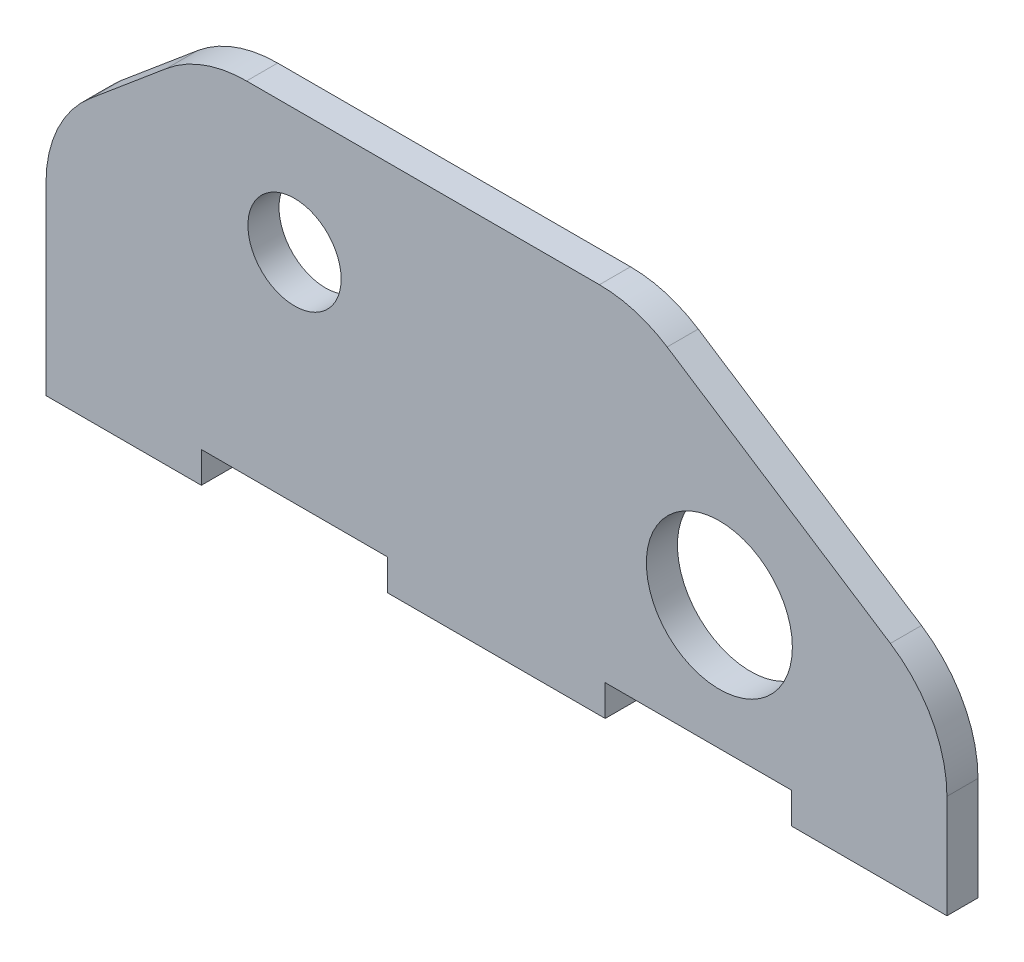
ISO-10303-21;
HEADER;
FILE_DESCRIPTION(('STEP AP214'),'2;1');
FILE_NAME('part.step','',(''),(''),'','','');
FILE_SCHEMA(('AUTOMOTIVE_DESIGN { 1 0 10303 214 1 1 1 1 }'));
ENDSEC;
DATA;
#1=APPLICATION_CONTEXT('core data for automotive mechanical design processes');
#2=APPLICATION_PROTOCOL_DEFINITION('international standard','automotive_design',2000,#1);
#3=PRODUCT_CONTEXT('',#1,'mechanical');
#4=PRODUCT('Part','Part','',(#3));
#5=PRODUCT_RELATED_PRODUCT_CATEGORY('part','',(#4));
#6=PRODUCT_DEFINITION_FORMATION('','',#4);
#7=PRODUCT_DEFINITION_CONTEXT('part definition',#1,'design');
#8=PRODUCT_DEFINITION('design','',#6,#7);
#9=PRODUCT_DEFINITION_SHAPE('','',#8);
#10=(LENGTH_UNIT() NAMED_UNIT(*) SI_UNIT(.MILLI.,.METRE.));
#11=(NAMED_UNIT(*) PLANE_ANGLE_UNIT() SI_UNIT($,.RADIAN.));
#12=(NAMED_UNIT(*) SI_UNIT($,.STERADIAN.) SOLID_ANGLE_UNIT());
#13=UNCERTAINTY_MEASURE_WITH_UNIT(LENGTH_MEASURE(1.E-05),#10,'distance_accuracy_value','');
#14=(GEOMETRIC_REPRESENTATION_CONTEXT(3) GLOBAL_UNCERTAINTY_ASSIGNED_CONTEXT((#13)) GLOBAL_UNIT_ASSIGNED_CONTEXT((#10,
#11,#12)) REPRESENTATION_CONTEXT('',''));
#15=CARTESIAN_POINT('',(0.,0.,0.));
#16=DIRECTION('',(0.,0.,1.));
#17=DIRECTION('',(1.,0.,0.));
#18=AXIS2_PLACEMENT_3D('',#15,#16,#17);
#19=CARTESIAN_POINT('',(0.,0.,10.));
#20=DIRECTION('',(0.,0.,-1.));
#21=DIRECTION('',(-1.,0.,0.));
#22=AXIS2_PLACEMENT_3D('',#19,#20,#21);
#23=PLANE('',#22);
#24=CARTESIAN_POINT('',(80.,80.,10.));
#25=DIRECTION('',(0.,0.,1.));
#26=DIRECTION('',(1.,0.,0.));
#27=AXIS2_PLACEMENT_3D('',#24,#25,#26);
#28=CIRCLE('',#27,15.);
#29=CARTESIAN_POINT('',(95.,80.,10.));
#30=VERTEX_POINT('',#29);
#31=EDGE_CURVE('E309',#30,#30,#28,.T.);
#32=ORIENTED_EDGE('',*,*,#31,.F.);
#33=EDGE_LOOP('',(#32));
#34=FACE_BOUND('',#33,.T.);
#35=DIRECTION('',(0.,1.,0.));
#36=VECTOR('',#35,1.);
#37=CARTESIAN_POINT('',(290.,0.,10.));
#38=LINE('',#37,#36);
#39=CARTESIAN_POINT('',(290.,0.,10.));
#40=VERTEX_POINT('',#39);
#41=CARTESIAN_POINT('',(290.,33.2925582324937,10.));
#42=VERTEX_POINT('',#41);
#43=EDGE_CURVE('E305',#40,#42,#38,.T.);
#44=ORIENTED_EDGE('',*,*,#43,.T.);
#45=CARTESIAN_POINT('',(250.,33.2925582324937,10.));
#46=DIRECTION('',(0.,0.,-1.));
#47=DIRECTION('',(-1.,0.,0.));
#48=AXIS2_PLACEMENT_3D('',#45,#46,#47);
#49=CIRCLE('',#48,40.);
#50=CARTESIAN_POINT('',(271.799534023816,66.8303028845193,10.));
#51=VERTEX_POINT('',#50);
#52=EDGE_CURVE('E208',#42,#51,#49,.F.);
#53=ORIENTED_EDGE('',*,*,#52,.T.);
#54=DIRECTION('',(-0.838443616300637,0.544988350595414,0.));
#55=VECTOR('',#54,1.);
#56=CARTESIAN_POINT('',(290.,55.,10.));
#57=LINE('',#56,#55);
#58=CARTESIAN_POINT('',(199.941931304576,113.537744652025,10.));
#59=VERTEX_POINT('',#58);
#60=EDGE_CURVE('E299',#51,#59,#57,.T.);
#61=ORIENTED_EDGE('',*,*,#60,.T.);
#62=CARTESIAN_POINT('',(178.14239728076,80.,10.));
#63=DIRECTION('',(0.,0.,-1.));
#64=DIRECTION('',(-1.,0.,0.));
#65=AXIS2_PLACEMENT_3D('',#62,#63,#64);
#66=CIRCLE('',#65,40.);
#67=CARTESIAN_POINT('',(178.14239728076,120.,10.));
#68=VERTEX_POINT('',#67);
#69=EDGE_CURVE('E206',#59,#68,#66,.F.);
#70=ORIENTED_EDGE('',*,*,#69,.T.);
#71=DIRECTION('',(-1.,0.,0.));
#72=VECTOR('',#71,1.);
#73=CARTESIAN_POINT('',(50.,120.,10.));
#74=LINE('',#73,#72);
#75=CARTESIAN_POINT('',(64.5588093706481,120.,10.));
#76=VERTEX_POINT('',#75);
#77=EDGE_CURVE('E298',#68,#76,#74,.T.);
#78=ORIENTED_EDGE('',*,*,#77,.T.);
#79=CARTESIAN_POINT('',(64.5588093706481,80.,10.));
#80=DIRECTION('',(0.,0.,-1.));
#81=DIRECTION('',(-1.,0.,0.));
#82=AXIS2_PLACEMENT_3D('',#79,#80,#81);
#83=CIRCLE('',#82,40.);
#84=CARTESIAN_POINT('',(38.8473049831865,110.641777724759,10.));
#85=VERTEX_POINT('',#84);
#86=EDGE_CURVE('E55',#76,#85,#83,.F.);
#87=ORIENTED_EDGE('',*,*,#86,.T.);
#88=DIRECTION('',(-0.766044443118979,-0.642787609686538,0.));
#89=VECTOR('',#88,1.);
#90=CARTESIAN_POINT('',(50.,120.,10.));
#91=LINE('',#90,#89);
#92=CARTESIAN_POINT('',(14.2884956125385,90.0344898396953,10.));
#93=VERTEX_POINT('',#92);
#94=EDGE_CURVE('E219',#85,#93,#91,.T.);
#95=ORIENTED_EDGE('',*,*,#94,.T.);
#96=CARTESIAN_POINT('',(40.,59.3927121149361,10.));
#97=DIRECTION('',(0.,0.,-1.));
#98=DIRECTION('',(-1.,0.,0.));
#99=AXIS2_PLACEMENT_3D('',#96,#97,#98);
#100=CIRCLE('',#99,40.);
#101=CARTESIAN_POINT('',(0.,59.3927121149361,10.));
#102=VERTEX_POINT('',#101);
#103=EDGE_CURVE('E165',#93,#102,#100,.F.);
#104=ORIENTED_EDGE('',*,*,#103,.T.);
#105=DIRECTION('',(0.,-1.,0.));
#106=VECTOR('',#105,1.);
#107=CARTESIAN_POINT('',(0.,0.,10.));
#108=LINE('',#107,#106);
#109=CARTESIAN_POINT('',(0.,0.,10.));
#110=VERTEX_POINT('',#109);
#111=EDGE_CURVE('E158',#102,#110,#108,.T.);
#112=ORIENTED_EDGE('',*,*,#111,.T.);
#113=DIRECTION('',(1.,0.,0.));
#114=VECTOR('',#113,1.);
#115=CARTESIAN_POINT('',(0.,0.,10.));
#116=LINE('',#115,#114);
#117=CARTESIAN_POINT('',(50.,0.,10.));
#118=VERTEX_POINT('',#117);
#119=EDGE_CURVE('E162',#110,#118,#116,.T.);
#120=ORIENTED_EDGE('',*,*,#119,.T.);
#121=DIRECTION('',(0.,1.,0.));
#122=VECTOR('',#121,1.);
#123=CARTESIAN_POINT('',(50.,0.,10.));
#124=LINE('',#123,#122);
#125=CARTESIAN_POINT('',(50.,10.,10.));
#126=VERTEX_POINT('',#125);
#127=EDGE_CURVE('E178',#118,#126,#124,.T.);
#128=ORIENTED_EDGE('',*,*,#127,.T.);
#129=DIRECTION('',(1.,0.,0.));
#130=VECTOR('',#129,1.);
#131=CARTESIAN_POINT('',(50.,10.,10.));
#132=LINE('',#131,#130);
#133=CARTESIAN_POINT('',(110.,10.,10.));
#134=VERTEX_POINT('',#133);
#135=EDGE_CURVE('E261',#126,#134,#132,.T.);
#136=ORIENTED_EDGE('',*,*,#135,.T.);
#137=DIRECTION('',(0.,-1.,0.));
#138=VECTOR('',#137,1.);
#139=CARTESIAN_POINT('',(110.,10.,10.));
#140=LINE('',#139,#138);
#141=CARTESIAN_POINT('',(110.,0.,10.));
#142=VERTEX_POINT('',#141);
#143=EDGE_CURVE('E312',#134,#142,#140,.T.);
#144=ORIENTED_EDGE('',*,*,#143,.T.);
#145=DIRECTION('',(1.,0.,0.));
#146=VECTOR('',#145,1.);
#147=CARTESIAN_POINT('',(110.,0.,10.));
#148=LINE('',#147,#146);
#149=CARTESIAN_POINT('',(180.,0.,10.));
#150=VERTEX_POINT('',#149);
#151=EDGE_CURVE('E316',#142,#150,#148,.T.);
#152=ORIENTED_EDGE('',*,*,#151,.T.);
#153=DIRECTION('',(0.,1.,0.));
#154=VECTOR('',#153,1.);
#155=CARTESIAN_POINT('',(180.,0.,10.));
#156=LINE('',#155,#154);
#157=CARTESIAN_POINT('',(180.,10.,10.));
#158=VERTEX_POINT('',#157);
#159=EDGE_CURVE('E318',#150,#158,#156,.T.);
#160=ORIENTED_EDGE('',*,*,#159,.T.);
#161=DIRECTION('',(1.,0.,0.));
#162=VECTOR('',#161,1.);
#163=CARTESIAN_POINT('',(180.,10.,10.));
#164=LINE('',#163,#162);
#165=CARTESIAN_POINT('',(240.,10.,10.));
#166=VERTEX_POINT('',#165);
#167=EDGE_CURVE('E320',#158,#166,#164,.T.);
#168=ORIENTED_EDGE('',*,*,#167,.T.);
#169=DIRECTION('',(0.,-1.,0.));
#170=VECTOR('',#169,1.);
#171=CARTESIAN_POINT('',(240.,10.,10.));
#172=LINE('',#171,#170);
#173=CARTESIAN_POINT('',(240.,0.,10.));
#174=VERTEX_POINT('',#173);
#175=EDGE_CURVE('E322',#166,#174,#172,.T.);
#176=ORIENTED_EDGE('',*,*,#175,.T.);
#177=DIRECTION('',(1.,0.,0.));
#178=VECTOR('',#177,1.);
#179=CARTESIAN_POINT('',(240.,0.,10.));
#180=LINE('',#179,#178);
#181=EDGE_CURVE('E324',#174,#40,#180,.T.);
#182=ORIENTED_EDGE('',*,*,#181,.T.);
#183=EDGE_LOOP('',(#44,#53,#61,#70,#78,#87,#95,#104,#112,#120,#128,#136,#144,#152,#160,#168,
#176,#182));
#184=FACE_BOUND('',#183,.T.);
#185=CARTESIAN_POINT('',(216.747943311773,50.,10.));
#186=DIRECTION('',(0.,0.,1.));
#187=DIRECTION('',(1.,0.,0.));
#188=AXIS2_PLACEMENT_3D('',#185,#186,#187);
#189=CIRCLE('',#188,23.5000000000001);
#190=CARTESIAN_POINT('',(240.247943311774,50.,10.));
#191=VERTEX_POINT('',#190);
#192=EDGE_CURVE('E547',#191,#191,#189,.T.);
#193=ORIENTED_EDGE('',*,*,#192,.F.);
#194=EDGE_LOOP('',(#193));
#195=FACE_BOUND('',#194,.T.);
#196=ADVANCED_FACE('F33',(#34,#184,#195),#23,.F.);
#197=CARTESIAN_POINT('',(0.,0.,0.));
#198=DIRECTION('',(0.,0.,-1.));
#199=DIRECTION('',(-1.,0.,0.));
#200=AXIS2_PLACEMENT_3D('',#197,#198,#199);
#201=PLANE('',#200);
#202=CARTESIAN_POINT('',(80.,80.,0.));
#203=DIRECTION('',(0.,0.,1.));
#204=DIRECTION('',(1.,0.,0.));
#205=AXIS2_PLACEMENT_3D('',#202,#203,#204);
#206=CIRCLE('',#205,15.);
#207=CARTESIAN_POINT('',(95.,80.,0.));
#208=VERTEX_POINT('',#207);
#209=EDGE_CURVE('E552',#208,#208,#206,.T.);
#210=ORIENTED_EDGE('',*,*,#209,.T.);
#211=EDGE_LOOP('',(#210));
#212=FACE_BOUND('',#211,.T.);
#213=DIRECTION('',(-0.838443616300637,0.544988350595414,0.));
#214=VECTOR('',#213,1.);
#215=CARTESIAN_POINT('',(290.,55.,0.));
#216=LINE('',#215,#214);
#217=CARTESIAN_POINT('',(271.799534023816,66.8303028845193,0.));
#218=VERTEX_POINT('',#217);
#219=CARTESIAN_POINT('',(199.941931304576,113.537744652025,0.));
#220=VERTEX_POINT('',#219);
#221=EDGE_CURVE('E229',#218,#220,#216,.T.);
#222=ORIENTED_EDGE('',*,*,#221,.F.);
#223=CARTESIAN_POINT('',(250.,33.2925582324937,0.));
#224=DIRECTION('',(0.,0.,-1.));
#225=DIRECTION('',(-1.,0.,0.));
#226=AXIS2_PLACEMENT_3D('',#223,#224,#225);
#227=CIRCLE('',#226,40.);
#228=CARTESIAN_POINT('',(290.,33.2925582324937,0.));
#229=VERTEX_POINT('',#228);
#230=EDGE_CURVE('E200',#218,#229,#227,.T.);
#231=ORIENTED_EDGE('',*,*,#230,.T.);
#232=DIRECTION('',(0.,1.,0.));
#233=VECTOR('',#232,1.);
#234=CARTESIAN_POINT('',(290.,0.,0.));
#235=LINE('',#234,#233);
#236=CARTESIAN_POINT('',(290.,0.,0.));
#237=VERTEX_POINT('',#236);
#238=EDGE_CURVE('E284',#237,#229,#235,.T.);
#239=ORIENTED_EDGE('',*,*,#238,.F.);
#240=DIRECTION('',(1.,0.,0.));
#241=VECTOR('',#240,1.);
#242=CARTESIAN_POINT('',(240.,0.,0.));
#243=LINE('',#242,#241);
#244=CARTESIAN_POINT('',(240.,0.,0.));
#245=VERTEX_POINT('',#244);
#246=EDGE_CURVE('E282',#245,#237,#243,.T.);
#247=ORIENTED_EDGE('',*,*,#246,.F.);
#248=DIRECTION('',(0.,-1.,0.));
#249=VECTOR('',#248,1.);
#250=CARTESIAN_POINT('',(240.,10.,0.));
#251=LINE('',#250,#249);
#252=CARTESIAN_POINT('',(240.,10.,0.));
#253=VERTEX_POINT('',#252);
#254=EDGE_CURVE('E280',#253,#245,#251,.T.);
#255=ORIENTED_EDGE('',*,*,#254,.F.);
#256=DIRECTION('',(1.,0.,0.));
#257=VECTOR('',#256,1.);
#258=CARTESIAN_POINT('',(180.,10.,0.));
#259=LINE('',#258,#257);
#260=CARTESIAN_POINT('',(180.,10.,0.));
#261=VERTEX_POINT('',#260);
#262=EDGE_CURVE('E278',#261,#253,#259,.T.);
#263=ORIENTED_EDGE('',*,*,#262,.F.);
#264=DIRECTION('',(0.,1.,0.));
#265=VECTOR('',#264,1.);
#266=CARTESIAN_POINT('',(180.,0.,0.));
#267=LINE('',#266,#265);
#268=CARTESIAN_POINT('',(180.,0.,0.));
#269=VERTEX_POINT('',#268);
#270=EDGE_CURVE('E276',#269,#261,#267,.T.);
#271=ORIENTED_EDGE('',*,*,#270,.F.);
#272=DIRECTION('',(1.,0.,0.));
#273=VECTOR('',#272,1.);
#274=CARTESIAN_POINT('',(110.,0.,0.));
#275=LINE('',#274,#273);
#276=CARTESIAN_POINT('',(110.,0.,0.));
#277=VERTEX_POINT('',#276);
#278=EDGE_CURVE('E269',#277,#269,#275,.T.);
#279=ORIENTED_EDGE('',*,*,#278,.F.);
#280=DIRECTION('',(0.,-1.,0.));
#281=VECTOR('',#280,1.);
#282=CARTESIAN_POINT('',(110.,10.,0.));
#283=LINE('',#282,#281);
#284=CARTESIAN_POINT('',(110.,10.,0.));
#285=VERTEX_POINT('',#284);
#286=EDGE_CURVE('E267',#285,#277,#283,.T.);
#287=ORIENTED_EDGE('',*,*,#286,.F.);
#288=DIRECTION('',(1.,0.,0.));
#289=VECTOR('',#288,1.);
#290=CARTESIAN_POINT('',(50.,10.,0.));
#291=LINE('',#290,#289);
#292=CARTESIAN_POINT('',(50.,10.,0.));
#293=VERTEX_POINT('',#292);
#294=EDGE_CURVE('E260',#293,#285,#291,.T.);
#295=ORIENTED_EDGE('',*,*,#294,.F.);
#296=DIRECTION('',(0.,1.,0.));
#297=VECTOR('',#296,1.);
#298=CARTESIAN_POINT('',(50.,0.,0.));
#299=LINE('',#298,#297);
#300=CARTESIAN_POINT('',(50.,0.,0.));
#301=VERTEX_POINT('',#300);
#302=EDGE_CURVE('E265',#301,#293,#299,.T.);
#303=ORIENTED_EDGE('',*,*,#302,.F.);
#304=DIRECTION('',(1.,0.,0.));
#305=VECTOR('',#304,1.);
#306=CARTESIAN_POINT('',(0.,0.,0.));
#307=LINE('',#306,#305);
#308=CARTESIAN_POINT('',(0.,0.,0.));
#309=VERTEX_POINT('',#308);
#310=EDGE_CURVE('E271',#309,#301,#307,.T.);
#311=ORIENTED_EDGE('',*,*,#310,.F.);
#312=DIRECTION('',(0.,-1.,0.));
#313=VECTOR('',#312,1.);
#314=CARTESIAN_POINT('',(0.,0.,0.));
#315=LINE('',#314,#313);
#316=CARTESIAN_POINT('',(0.,59.3927121149361,0.));
#317=VERTEX_POINT('',#316);
#318=EDGE_CURVE('E182',#317,#309,#315,.T.);
#319=ORIENTED_EDGE('',*,*,#318,.F.);
#320=CARTESIAN_POINT('',(40.,59.3927121149361,0.));
#321=DIRECTION('',(0.,0.,-1.));
#322=DIRECTION('',(-1.,0.,0.));
#323=AXIS2_PLACEMENT_3D('',#320,#321,#322);
#324=CIRCLE('',#323,40.);
#325=CARTESIAN_POINT('',(14.2884956125385,90.0344898396953,0.));
#326=VERTEX_POINT('',#325);
#327=EDGE_CURVE('E194',#317,#326,#324,.T.);
#328=ORIENTED_EDGE('',*,*,#327,.T.);
#329=DIRECTION('',(-0.766044443118979,-0.642787609686538,0.));
#330=VECTOR('',#329,1.);
#331=CARTESIAN_POINT('',(50.,120.,0.));
#332=LINE('',#331,#330);
#333=CARTESIAN_POINT('',(38.8473049831865,110.641777724759,0.));
#334=VERTEX_POINT('',#333);
#335=EDGE_CURVE('E169',#334,#326,#332,.T.);
#336=ORIENTED_EDGE('',*,*,#335,.F.);
#337=CARTESIAN_POINT('',(64.5588093706481,80.,0.));
#338=DIRECTION('',(0.,0.,-1.));
#339=DIRECTION('',(-1.,0.,0.));
#340=AXIS2_PLACEMENT_3D('',#337,#338,#339);
#341=CIRCLE('',#340,40.);
#342=CARTESIAN_POINT('',(64.5588093706481,120.,0.));
#343=VERTEX_POINT('',#342);
#344=EDGE_CURVE('E196',#334,#343,#341,.T.);
#345=ORIENTED_EDGE('',*,*,#344,.T.);
#346=DIRECTION('',(-1.,0.,0.));
#347=VECTOR('',#346,1.);
#348=CARTESIAN_POINT('',(50.,120.,0.));
#349=LINE('',#348,#347);
#350=CARTESIAN_POINT('',(178.14239728076,120.,0.));
#351=VERTEX_POINT('',#350);
#352=EDGE_CURVE('E227',#351,#343,#349,.T.);
#353=ORIENTED_EDGE('',*,*,#352,.F.);
#354=CARTESIAN_POINT('',(178.14239728076,80.,0.));
#355=DIRECTION('',(0.,0.,-1.));
#356=DIRECTION('',(-1.,0.,0.));
#357=AXIS2_PLACEMENT_3D('',#354,#355,#356);
#358=CIRCLE('',#357,40.);
#359=EDGE_CURVE('E198',#351,#220,#358,.T.);
#360=ORIENTED_EDGE('',*,*,#359,.T.);
#361=EDGE_LOOP('',(#222,#231,#239,#247,#255,#263,#271,#279,#287,#295,#303,#311,#319,#328,#336,
#345,#353,#360));
#362=FACE_BOUND('',#361,.T.);
#363=CARTESIAN_POINT('',(216.747943311773,50.,0.));
#364=DIRECTION('',(0.,0.,1.));
#365=DIRECTION('',(1.,0.,0.));
#366=AXIS2_PLACEMENT_3D('',#363,#364,#365);
#367=CIRCLE('',#366,23.5000000000001);
#368=CARTESIAN_POINT('',(240.247943311774,50.,0.));
#369=VERTEX_POINT('',#368);
#370=EDGE_CURVE('E550',#369,#369,#367,.T.);
#371=ORIENTED_EDGE('',*,*,#370,.T.);
#372=EDGE_LOOP('',(#371));
#373=FACE_BOUND('',#372,.T.);
#374=ADVANCED_FACE('F223',(#212,#362,#373),#201,.T.);
#375=CARTESIAN_POINT('',(0.,0.,10.));
#376=DIRECTION('',(1.,0.,0.));
#377=DIRECTION('',(0.,1.,0.));
#378=AXIS2_PLACEMENT_3D('',#375,#376,#377);
#379=PLANE('',#378);
#380=ORIENTED_EDGE('',*,*,#111,.F.);
#381=DIRECTION('',(0.,0.,-1.));
#382=VECTOR('',#381,1.);
#383=CARTESIAN_POINT('',(0.,59.3927121149361,10.));
#384=LINE('',#383,#382);
#385=EDGE_CURVE('E11',#102,#317,#384,.T.);
#386=ORIENTED_EDGE('',*,*,#385,.T.);
#387=ORIENTED_EDGE('',*,*,#318,.T.);
#388=DIRECTION('',(0.,0.,-1.));
#389=VECTOR('',#388,1.);
#390=CARTESIAN_POINT('',(0.,0.,10.));
#391=LINE('',#390,#389);
#392=EDGE_CURVE('E174',#110,#309,#391,.T.);
#393=ORIENTED_EDGE('',*,*,#392,.F.);
#394=EDGE_LOOP('',(#380,#386,#387,#393));
#395=FACE_BOUND('',#394,.T.);
#396=ADVANCED_FACE('F180',(#395),#379,.F.);
#397=CARTESIAN_POINT('',(0.,0.,10.));
#398=DIRECTION('',(0.,1.,0.));
#399=DIRECTION('',(0.,0.,1.));
#400=AXIS2_PLACEMENT_3D('',#397,#398,#399);
#401=PLANE('',#400);
#402=ORIENTED_EDGE('',*,*,#310,.T.);
#403=DIRECTION('',(0.,0.,-1.));
#404=VECTOR('',#403,1.);
#405=CARTESIAN_POINT('',(50.,0.,10.));
#406=LINE('',#405,#404);
#407=EDGE_CURVE('E176',#118,#301,#406,.T.);
#408=ORIENTED_EDGE('',*,*,#407,.F.);
#409=ORIENTED_EDGE('',*,*,#119,.F.);
#410=ORIENTED_EDGE('',*,*,#392,.T.);
#411=EDGE_LOOP('',(#402,#408,#409,#410));
#412=FACE_BOUND('',#411,.T.);
#413=ADVANCED_FACE('F173',(#412),#401,.F.);
#414=CARTESIAN_POINT('',(50.,0.,10.));
#415=DIRECTION('',(-1.,0.,0.));
#416=DIRECTION('',(0.,0.,1.));
#417=AXIS2_PLACEMENT_3D('',#414,#415,#416);
#418=PLANE('',#417);
#419=ORIENTED_EDGE('',*,*,#302,.T.);
#420=DIRECTION('',(0.,0.,-1.));
#421=VECTOR('',#420,1.);
#422=CARTESIAN_POINT('',(50.,10.,10.));
#423=LINE('',#422,#421);
#424=EDGE_CURVE('E188',#126,#293,#423,.T.);
#425=ORIENTED_EDGE('',*,*,#424,.F.);
#426=ORIENTED_EDGE('',*,*,#127,.F.);
#427=ORIENTED_EDGE('',*,*,#407,.T.);
#428=EDGE_LOOP('',(#419,#425,#426,#427));
#429=FACE_BOUND('',#428,.T.);
#430=ADVANCED_FACE('F310',(#429),#418,.F.);
#431=CARTESIAN_POINT('',(50.,10.,10.));
#432=DIRECTION('',(0.,1.,0.));
#433=DIRECTION('',(0.,0.,1.));
#434=AXIS2_PLACEMENT_3D('',#431,#432,#433);
#435=PLANE('',#434);
#436=ORIENTED_EDGE('',*,*,#294,.T.);
#437=DIRECTION('',(0.,0.,-1.));
#438=VECTOR('',#437,1.);
#439=CARTESIAN_POINT('',(110.,10.,10.));
#440=LINE('',#439,#438);
#441=EDGE_CURVE('E251',#134,#285,#440,.T.);
#442=ORIENTED_EDGE('',*,*,#441,.F.);
#443=ORIENTED_EDGE('',*,*,#135,.F.);
#444=ORIENTED_EDGE('',*,*,#424,.T.);
#445=EDGE_LOOP('',(#436,#442,#443,#444));
#446=FACE_BOUND('',#445,.T.);
#447=ADVANCED_FACE('F258',(#446),#435,.F.);
#448=CARTESIAN_POINT('',(110.,10.,10.));
#449=DIRECTION('',(1.,0.,0.));
#450=DIRECTION('',(0.,0.,-1.));
#451=AXIS2_PLACEMENT_3D('',#448,#449,#450);
#452=PLANE('',#451);
#453=ORIENTED_EDGE('',*,*,#286,.T.);
#454=DIRECTION('',(0.,0.,-1.));
#455=VECTOR('',#454,1.);
#456=CARTESIAN_POINT('',(110.,0.,10.));
#457=LINE('',#456,#455);
#458=EDGE_CURVE('E248',#142,#277,#457,.T.);
#459=ORIENTED_EDGE('',*,*,#458,.F.);
#460=ORIENTED_EDGE('',*,*,#143,.F.);
#461=ORIENTED_EDGE('',*,*,#441,.T.);
#462=EDGE_LOOP('',(#453,#459,#460,#461));
#463=FACE_BOUND('',#462,.T.);
#464=ADVANCED_FACE('F360',(#463),#452,.F.);
#465=CARTESIAN_POINT('',(110.,0.,10.));
#466=DIRECTION('',(0.,1.,0.));
#467=DIRECTION('',(0.,0.,1.));
#468=AXIS2_PLACEMENT_3D('',#465,#466,#467);
#469=PLANE('',#468);
#470=ORIENTED_EDGE('',*,*,#278,.T.);
#471=DIRECTION('',(0.,0.,-1.));
#472=VECTOR('',#471,1.);
#473=CARTESIAN_POINT('',(180.,0.,10.));
#474=LINE('',#473,#472);
#475=EDGE_CURVE('E245',#150,#269,#474,.T.);
#476=ORIENTED_EDGE('',*,*,#475,.F.);
#477=ORIENTED_EDGE('',*,*,#151,.F.);
#478=ORIENTED_EDGE('',*,*,#458,.T.);
#479=EDGE_LOOP('',(#470,#476,#477,#478));
#480=FACE_BOUND('',#479,.T.);
#481=ADVANCED_FACE('F355',(#480),#469,.F.);
#482=CARTESIAN_POINT('',(180.,0.,10.));
#483=DIRECTION('',(-1.,0.,0.));
#484=DIRECTION('',(0.,0.,1.));
#485=AXIS2_PLACEMENT_3D('',#482,#483,#484);
#486=PLANE('',#485);
#487=ORIENTED_EDGE('',*,*,#270,.T.);
#488=DIRECTION('',(0.,0.,-1.));
#489=VECTOR('',#488,1.);
#490=CARTESIAN_POINT('',(180.,10.,10.));
#491=LINE('',#490,#489);
#492=EDGE_CURVE('E242',#158,#261,#491,.T.);
#493=ORIENTED_EDGE('',*,*,#492,.F.);
#494=ORIENTED_EDGE('',*,*,#159,.F.);
#495=ORIENTED_EDGE('',*,*,#475,.T.);
#496=EDGE_LOOP('',(#487,#493,#494,#495));
#497=FACE_BOUND('',#496,.T.);
#498=ADVANCED_FACE('F352',(#497),#486,.F.);
#499=CARTESIAN_POINT('',(180.,10.,10.));
#500=DIRECTION('',(0.,1.,0.));
#501=DIRECTION('',(0.,0.,1.));
#502=AXIS2_PLACEMENT_3D('',#499,#500,#501);
#503=PLANE('',#502);
#504=ORIENTED_EDGE('',*,*,#262,.T.);
#505=DIRECTION('',(0.,0.,-1.));
#506=VECTOR('',#505,1.);
#507=CARTESIAN_POINT('',(240.,10.,10.));
#508=LINE('',#507,#506);
#509=EDGE_CURVE('E239',#166,#253,#508,.T.);
#510=ORIENTED_EDGE('',*,*,#509,.F.);
#511=ORIENTED_EDGE('',*,*,#167,.F.);
#512=ORIENTED_EDGE('',*,*,#492,.T.);
#513=EDGE_LOOP('',(#504,#510,#511,#512));
#514=FACE_BOUND('',#513,.T.);
#515=ADVANCED_FACE('F348',(#514),#503,.F.);
#516=CARTESIAN_POINT('',(240.,10.,10.));
#517=DIRECTION('',(1.,0.,0.));
#518=DIRECTION('',(0.,0.,-1.));
#519=AXIS2_PLACEMENT_3D('',#516,#517,#518);
#520=PLANE('',#519);
#521=ORIENTED_EDGE('',*,*,#254,.T.);
#522=DIRECTION('',(0.,0.,-1.));
#523=VECTOR('',#522,1.);
#524=CARTESIAN_POINT('',(240.,0.,10.));
#525=LINE('',#524,#523);
#526=EDGE_CURVE('E236',#174,#245,#525,.T.);
#527=ORIENTED_EDGE('',*,*,#526,.F.);
#528=ORIENTED_EDGE('',*,*,#175,.F.);
#529=ORIENTED_EDGE('',*,*,#509,.T.);
#530=EDGE_LOOP('',(#521,#527,#528,#529));
#531=FACE_BOUND('',#530,.T.);
#532=ADVANCED_FACE('F343',(#531),#520,.F.);
#533=CARTESIAN_POINT('',(240.,0.,10.));
#534=DIRECTION('',(0.,1.,0.));
#535=DIRECTION('',(0.,0.,1.));
#536=AXIS2_PLACEMENT_3D('',#533,#534,#535);
#537=PLANE('',#536);
#538=ORIENTED_EDGE('',*,*,#246,.T.);
#539=DIRECTION('',(0.,0.,-1.));
#540=VECTOR('',#539,1.);
#541=CARTESIAN_POINT('',(290.,0.,10.));
#542=LINE('',#541,#540);
#543=EDGE_CURVE('E233',#40,#237,#542,.T.);
#544=ORIENTED_EDGE('',*,*,#543,.F.);
#545=ORIENTED_EDGE('',*,*,#181,.F.);
#546=ORIENTED_EDGE('',*,*,#526,.T.);
#547=EDGE_LOOP('',(#538,#544,#545,#546));
#548=FACE_BOUND('',#547,.T.);
#549=ADVANCED_FACE('F337',(#548),#537,.F.);
#550=CARTESIAN_POINT('',(290.,0.,10.));
#551=DIRECTION('',(-1.,0.,0.));
#552=DIRECTION('',(0.,0.,1.));
#553=AXIS2_PLACEMENT_3D('',#550,#551,#552);
#554=PLANE('',#553);
#555=ORIENTED_EDGE('',*,*,#238,.T.);
#556=DIRECTION('',(0.,0.,-1.));
#557=VECTOR('',#556,1.);
#558=CARTESIAN_POINT('',(290.,33.2925582324937,10.));
#559=LINE('',#558,#557);
#560=EDGE_CURVE('E202',#229,#42,#559,.F.);
#561=ORIENTED_EDGE('',*,*,#560,.T.);
#562=ORIENTED_EDGE('',*,*,#43,.F.);
#563=ORIENTED_EDGE('',*,*,#543,.T.);
#564=EDGE_LOOP('',(#555,#561,#562,#563));
#565=FACE_BOUND('',#564,.T.);
#566=ADVANCED_FACE('F335',(#565),#554,.F.);
#567=CARTESIAN_POINT('',(290.,55.,10.));
#568=DIRECTION('',(-0.544988350595414,-0.838443616300637,0.));
#569=DIRECTION('',(0.838443616300637,-0.544988350595414,0.));
#570=AXIS2_PLACEMENT_3D('',#567,#568,#569);
#571=PLANE('',#570);
#572=ORIENTED_EDGE('',*,*,#60,.F.);
#573=DIRECTION('',(0.,0.,-1.));
#574=VECTOR('',#573,1.);
#575=CARTESIAN_POINT('',(271.799534023816,66.8303028845193,10.));
#576=LINE('',#575,#574);
#577=EDGE_CURVE('E186',#51,#218,#576,.T.);
#578=ORIENTED_EDGE('',*,*,#577,.T.);
#579=ORIENTED_EDGE('',*,*,#221,.T.);
#580=DIRECTION('',(0.,0.,-1.));
#581=VECTOR('',#580,1.);
#582=CARTESIAN_POINT('',(199.941931304576,113.537744652025,10.));
#583=LINE('',#582,#581);
#584=EDGE_CURVE('E184',#220,#59,#583,.F.);
#585=ORIENTED_EDGE('',*,*,#584,.T.);
#586=EDGE_LOOP('',(#572,#578,#579,#585));
#587=FACE_BOUND('',#586,.T.);
#588=ADVANCED_FACE('F290',(#587),#571,.F.);
#589=CARTESIAN_POINT('',(50.,120.,10.));
#590=DIRECTION('',(0.,-1.,0.));
#591=DIRECTION('',(0.,0.,-1.));
#592=AXIS2_PLACEMENT_3D('',#589,#590,#591);
#593=PLANE('',#592);
#594=ORIENTED_EDGE('',*,*,#77,.F.);
#595=DIRECTION('',(0.,0.,-1.));
#596=VECTOR('',#595,1.);
#597=CARTESIAN_POINT('',(178.14239728076,120.,10.));
#598=LINE('',#597,#596);
#599=EDGE_CURVE('E212',#68,#351,#598,.T.);
#600=ORIENTED_EDGE('',*,*,#599,.T.);
#601=ORIENTED_EDGE('',*,*,#352,.T.);
#602=DIRECTION('',(0.,0.,-1.));
#603=VECTOR('',#602,1.);
#604=CARTESIAN_POINT('',(64.5588093706481,120.,10.));
#605=LINE('',#604,#603);
#606=EDGE_CURVE('E210',#343,#76,#605,.F.);
#607=ORIENTED_EDGE('',*,*,#606,.T.);
#608=EDGE_LOOP('',(#594,#600,#601,#607));
#609=FACE_BOUND('',#608,.T.);
#610=ADVANCED_FACE('F301',(#609),#593,.F.);
#611=CARTESIAN_POINT('',(50.,120.,10.));
#612=DIRECTION('',(0.642787609686538,-0.766044443118979,0.));
#613=DIRECTION('',(0.766044443118979,0.642787609686538,0.));
#614=AXIS2_PLACEMENT_3D('',#611,#612,#613);
#615=PLANE('',#614);
#616=ORIENTED_EDGE('',*,*,#94,.F.);
#617=DIRECTION('',(0.,0.,-1.));
#618=VECTOR('',#617,1.);
#619=CARTESIAN_POINT('',(38.8473049831865,110.641777724759,10.));
#620=LINE('',#619,#618);
#621=EDGE_CURVE('E41',#85,#334,#620,.T.);
#622=ORIENTED_EDGE('',*,*,#621,.T.);
#623=ORIENTED_EDGE('',*,*,#335,.T.);
#624=DIRECTION('',(0.,0.,-1.));
#625=VECTOR('',#624,1.);
#626=CARTESIAN_POINT('',(14.2884956125385,90.0344898396953,10.));
#627=LINE('',#626,#625);
#628=EDGE_CURVE('E48',#326,#93,#627,.F.);
#629=ORIENTED_EDGE('',*,*,#628,.T.);
#630=EDGE_LOOP('',(#616,#622,#623,#629));
#631=FACE_BOUND('',#630,.T.);
#632=ADVANCED_FACE('F218',(#631),#615,.F.);
#633=CARTESIAN_POINT('',(80.,80.,10.));
#634=DIRECTION('',(0.,0.,-1.));
#635=DIRECTION('',(-1.,0.,0.));
#636=AXIS2_PLACEMENT_3D('',#633,#634,#635);
#637=CYLINDRICAL_SURFACE('',#636,15.);
#638=ORIENTED_EDGE('',*,*,#31,.T.);
#639=EDGE_LOOP('',(#638));
#640=FACE_BOUND('',#639,.T.);
#641=ORIENTED_EDGE('',*,*,#209,.F.);
#642=EDGE_LOOP('',(#641));
#643=FACE_BOUND('',#642,.T.);
#644=ADVANCED_FACE('F379',(#640,#643),#637,.F.);
#645=CARTESIAN_POINT('',(216.747943311773,50.,10.));
#646=DIRECTION('',(0.,0.,-1.));
#647=DIRECTION('',(-1.,0.,0.));
#648=AXIS2_PLACEMENT_3D('',#645,#646,#647);
#649=CYLINDRICAL_SURFACE('',#648,23.5000000000001);
#650=ORIENTED_EDGE('',*,*,#192,.T.);
#651=EDGE_LOOP('',(#650));
#652=FACE_BOUND('',#651,.T.);
#653=ORIENTED_EDGE('',*,*,#370,.F.);
#654=EDGE_LOOP('',(#653));
#655=FACE_BOUND('',#654,.T.);
#656=ADVANCED_FACE('F437',(#652,#655),#649,.F.);
#657=CARTESIAN_POINT('',(250.,33.2925582324937,10.));
#658=DIRECTION('',(0.,0.,-1.));
#659=DIRECTION('',(-1.,0.,0.));
#660=AXIS2_PLACEMENT_3D('',#657,#658,#659);
#661=CYLINDRICAL_SURFACE('',#660,40.);
#662=ORIENTED_EDGE('',*,*,#52,.F.);
#663=ORIENTED_EDGE('',*,*,#560,.F.);
#664=ORIENTED_EDGE('',*,*,#230,.F.);
#665=ORIENTED_EDGE('',*,*,#577,.F.);
#666=EDGE_LOOP('',(#662,#663,#664,#665));
#667=FACE_BOUND('',#666,.T.);
#668=ADVANCED_FACE('F332',(#667),#661,.T.);
#669=CARTESIAN_POINT('',(178.14239728076,80.,10.));
#670=DIRECTION('',(0.,0.,-1.));
#671=DIRECTION('',(-1.,0.,0.));
#672=AXIS2_PLACEMENT_3D('',#669,#670,#671);
#673=CYLINDRICAL_SURFACE('',#672,40.);
#674=ORIENTED_EDGE('',*,*,#69,.F.);
#675=ORIENTED_EDGE('',*,*,#584,.F.);
#676=ORIENTED_EDGE('',*,*,#359,.F.);
#677=ORIENTED_EDGE('',*,*,#599,.F.);
#678=EDGE_LOOP('',(#674,#675,#676,#677));
#679=FACE_BOUND('',#678,.T.);
#680=ADVANCED_FACE('F295',(#679),#673,.T.);
#681=CARTESIAN_POINT('',(64.5588093706481,80.,10.));
#682=DIRECTION('',(0.,0.,-1.));
#683=DIRECTION('',(-1.,0.,0.));
#684=AXIS2_PLACEMENT_3D('',#681,#682,#683);
#685=CYLINDRICAL_SURFACE('',#684,40.);
#686=ORIENTED_EDGE('',*,*,#86,.F.);
#687=ORIENTED_EDGE('',*,*,#606,.F.);
#688=ORIENTED_EDGE('',*,*,#344,.F.);
#689=ORIENTED_EDGE('',*,*,#621,.F.);
#690=EDGE_LOOP('',(#686,#687,#688,#689));
#691=FACE_BOUND('',#690,.T.);
#692=ADVANCED_FACE('F455',(#691),#685,.T.);
#693=CARTESIAN_POINT('',(40.,59.3927121149361,10.));
#694=DIRECTION('',(0.,0.,-1.));
#695=DIRECTION('',(-1.,0.,0.));
#696=AXIS2_PLACEMENT_3D('',#693,#694,#695);
#697=CYLINDRICAL_SURFACE('',#696,40.);
#698=ORIENTED_EDGE('',*,*,#103,.F.);
#699=ORIENTED_EDGE('',*,*,#628,.F.);
#700=ORIENTED_EDGE('',*,*,#327,.F.);
#701=ORIENTED_EDGE('',*,*,#385,.F.);
#702=EDGE_LOOP('',(#698,#699,#700,#701));
#703=FACE_BOUND('',#702,.T.);
#704=ADVANCED_FACE('F35',(#703),#697,.T.);
#705=CLOSED_SHELL('',(#196,#374,#396,#413,#430,#447,#464,#481,#498,#515,#532,#549,#566,#588,
#610,#632,#644,#656,#668,#680,#692,#704));
#706=MANIFOLD_SOLID_BREP('B2',#705);
#707=ADVANCED_BREP_SHAPE_REPRESENTATION('',(#18,#706),#14);
#708=SHAPE_DEFINITION_REPRESENTATION(#9,#707);
ENDSEC;
END-ISO-10303-21;
